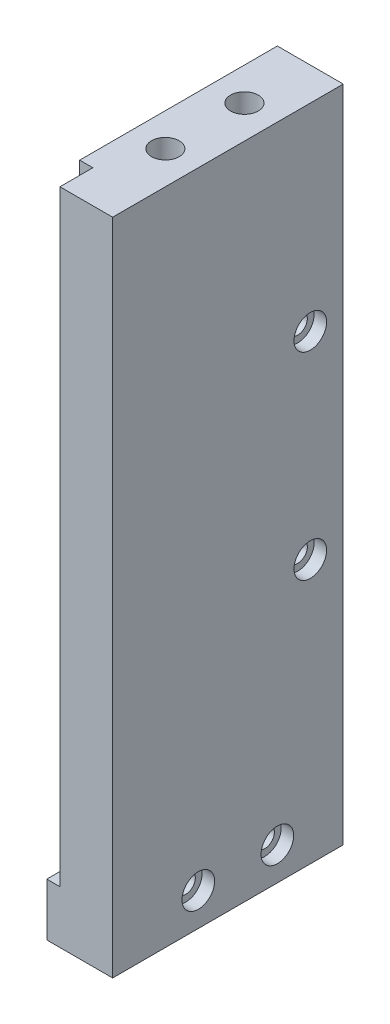
ISO-10303-21;
HEADER;
FILE_DESCRIPTION(('STEP AP214'),'2;1');
FILE_NAME('part.step','',(''),(''),'','','');
FILE_SCHEMA(('AUTOMOTIVE_DESIGN { 1 0 10303 214 1 1 1 1 }'));
ENDSEC;
DATA;
#1=APPLICATION_CONTEXT('core data for automotive mechanical design processes');
#2=APPLICATION_PROTOCOL_DEFINITION('international standard','automotive_design',2000,#1);
#3=PRODUCT_CONTEXT('',#1,'mechanical');
#4=PRODUCT('Part','Part','',(#3));
#5=PRODUCT_RELATED_PRODUCT_CATEGORY('part','',(#4));
#6=PRODUCT_DEFINITION_FORMATION('','',#4);
#7=PRODUCT_DEFINITION_CONTEXT('part definition',#1,'design');
#8=PRODUCT_DEFINITION('design','',#6,#7);
#9=PRODUCT_DEFINITION_SHAPE('','',#8);
#10=(LENGTH_UNIT() NAMED_UNIT(*) SI_UNIT(.MILLI.,.METRE.));
#11=(NAMED_UNIT(*) PLANE_ANGLE_UNIT() SI_UNIT($,.RADIAN.));
#12=(NAMED_UNIT(*) SI_UNIT($,.STERADIAN.) SOLID_ANGLE_UNIT());
#13=UNCERTAINTY_MEASURE_WITH_UNIT(LENGTH_MEASURE(1.E-05),#10,'distance_accuracy_value','');
#14=(GEOMETRIC_REPRESENTATION_CONTEXT(3) GLOBAL_UNCERTAINTY_ASSIGNED_CONTEXT((#13)) GLOBAL_UNIT_ASSIGNED_CONTEXT((#10,
#11,#12)) REPRESENTATION_CONTEXT('',''));
#15=CARTESIAN_POINT('',(0.,0.,0.));
#16=DIRECTION('',(0.,0.,1.));
#17=DIRECTION('',(1.,0.,0.));
#18=AXIS2_PLACEMENT_3D('',#15,#16,#17);
#19=CARTESIAN_POINT('',(31.0654967691147,25.9679125528914,-114.348756211209));
#20=DIRECTION('',(0.,1.,0.));
#21=DIRECTION('',(0.,0.,1.));
#22=AXIS2_PLACEMENT_3D('',#19,#20,#21);
#23=PLANE('',#22);
#24=CARTESIAN_POINT('',(36.0654967691147,25.9679125528914,-3.84999999999986));
#25=DIRECTION('',(0.,1.,0.));
#26=DIRECTION('',(0.,0.,1.));
#27=AXIS2_PLACEMENT_3D('',#24,#25,#26);
#28=CIRCLE('',#27,2.1);
#29=CARTESIAN_POINT('',(36.0654967691147,25.9679125528914,-1.74999999999987));
#30=VERTEX_POINT('',#29);
#31=EDGE_CURVE('E148',#30,#30,#28,.T.);
#32=ORIENTED_EDGE('',*,*,#31,.F.);
#33=EDGE_LOOP('',(#32));
#34=FACE_BOUND('',#33,.T.);
#35=CARTESIAN_POINT('',(36.0654967691147,25.9679125528914,8.15000000000014));
#36=DIRECTION('',(0.,1.,0.));
#37=DIRECTION('',(0.,0.,1.));
#38=AXIS2_PLACEMENT_3D('',#35,#36,#37);
#39=CIRCLE('',#38,2.1);
#40=CARTESIAN_POINT('',(36.0654967691147,25.9679125528914,10.2500000000001));
#41=VERTEX_POINT('',#40);
#42=EDGE_CURVE('E158',#41,#41,#39,.T.);
#43=ORIENTED_EDGE('',*,*,#42,.F.);
#44=EDGE_LOOP('',(#43));
#45=FACE_BOUND('',#44,.T.);
#46=DIRECTION('',(-1.,0.,0.));
#47=VECTOR('',#46,1.);
#48=CARTESIAN_POINT('',(-23.9345032308853,25.9679125528914,16.1500000000001));
#49=LINE('',#48,#47);
#50=CARTESIAN_POINT('',(33.0654967691147,25.9679125528914,16.1500000000001));
#51=VERTEX_POINT('',#50);
#52=CARTESIAN_POINT('',(31.0654967691147,25.9679125528914,16.1500000000001));
#53=VERTEX_POINT('',#52);
#54=EDGE_CURVE('E178',#51,#53,#49,.T.);
#55=ORIENTED_EDGE('',*,*,#54,.F.);
#56=DIRECTION('',(0.,0.,-1.));
#57=VECTOR('',#56,1.);
#58=CARTESIAN_POINT('',(33.0654967691147,25.9679125528914,21.1500000000001));
#59=LINE('',#58,#57);
#60=CARTESIAN_POINT('',(33.0654967691147,25.9679125528914,21.1500000000001));
#61=VERTEX_POINT('',#60);
#62=EDGE_CURVE('E175',#61,#51,#59,.T.);
#63=ORIENTED_EDGE('',*,*,#62,.F.);
#64=DIRECTION('',(-1.,0.,0.));
#65=VECTOR('',#64,1.);
#66=CARTESIAN_POINT('',(31.0654967691147,25.9679125528914,21.1500000000001));
#67=LINE('',#66,#65);
#68=CARTESIAN_POINT('',(41.0654967691147,25.9679125528914,21.1500000000001));
#69=VERTEX_POINT('',#68);
#70=EDGE_CURVE('E108',#69,#61,#67,.T.);
#71=ORIENTED_EDGE('',*,*,#70,.F.);
#72=DIRECTION('',(0.,0.,1.));
#73=VECTOR('',#72,1.);
#74=CARTESIAN_POINT('',(41.0654967691147,25.9679125528914,-114.348756211209));
#75=LINE('',#74,#73);
#76=CARTESIAN_POINT('',(41.0654967691147,25.9679125528914,-13.8499999999999));
#77=VERTEX_POINT('',#76);
#78=EDGE_CURVE('E107',#77,#69,#75,.T.);
#79=ORIENTED_EDGE('',*,*,#78,.F.);
#80=DIRECTION('',(1.,0.,0.));
#81=VECTOR('',#80,1.);
#82=CARTESIAN_POINT('',(31.0654967691147,25.9679125528914,-13.8499999999999));
#83=LINE('',#82,#81);
#84=CARTESIAN_POINT('',(31.0654967691147,25.9679125528914,-13.8499999999999));
#85=VERTEX_POINT('',#84);
#86=EDGE_CURVE('E161',#85,#77,#83,.T.);
#87=ORIENTED_EDGE('',*,*,#86,.F.);
#88=DIRECTION('',(0.,0.,-1.));
#89=VECTOR('',#88,1.);
#90=CARTESIAN_POINT('',(31.0654967691147,25.9679125528914,16.1500000000001));
#91=LINE('',#90,#89);
#92=EDGE_CURVE('E131',#53,#85,#91,.T.);
#93=ORIENTED_EDGE('',*,*,#92,.F.);
#94=EDGE_LOOP('',(#55,#63,#71,#79,#87,#93));
#95=FACE_BOUND('',#94,.T.);
#96=ADVANCED_FACE('F34',(#34,#45,#95),#23,.T.);
#97=CARTESIAN_POINT('',(39.1654967691147,-67.5820874471086,-3.84999999999986));
#98=DIRECTION('',(-1.,0.,0.));
#99=DIRECTION('',(0.,0.,1.));
#100=AXIS2_PLACEMENT_3D('',#97,#98,#99);
#101=PLANE('',#100);
#102=CARTESIAN_POINT('',(39.1654967691147,-69.0320874471086,-3.84999999999986));
#103=DIRECTION('',(1.,0.,0.));
#104=DIRECTION('',(0.,0.,-1.));
#105=AXIS2_PLACEMENT_3D('',#102,#103,#104);
#106=CIRCLE('',#105,1.44999999999999);
#107=CARTESIAN_POINT('',(39.1654967691147,-69.0320874471086,-5.29999999999986));
#108=VERTEX_POINT('',#107);
#109=EDGE_CURVE('E214',#108,#108,#106,.T.);
#110=ORIENTED_EDGE('',*,*,#109,.F.);
#111=EDGE_LOOP('',(#110));
#112=FACE_BOUND('',#111,.T.);
#113=CARTESIAN_POINT('',(39.1654967691147,-69.0320874471086,-3.84999999999986));
#114=DIRECTION('',(1.,0.,0.));
#115=DIRECTION('',(0.,0.,-1.));
#116=AXIS2_PLACEMENT_3D('',#113,#114,#115);
#117=CIRCLE('',#116,2.47499999999999);
#118=CARTESIAN_POINT('',(39.1654967691147,-69.0320874471086,-6.32499999999986));
#119=VERTEX_POINT('',#118);
#120=EDGE_CURVE('E211',#119,#119,#117,.T.);
#121=ORIENTED_EDGE('',*,*,#120,.T.);
#122=EDGE_LOOP('',(#121));
#123=FACE_BOUND('',#122,.T.);
#124=ADVANCED_FACE('F256',(#112,#123),#101,.F.);
#125=CARTESIAN_POINT('',(41.0654967691147,-69.0320874471086,-3.84999999999986));
#126=DIRECTION('',(1.,0.,0.));
#127=DIRECTION('',(0.,0.,-1.));
#128=AXIS2_PLACEMENT_3D('',#125,#126,#127);
#129=CYLINDRICAL_SURFACE('',#128,1.44999999999999);
#130=CARTESIAN_POINT('',(31.0654967691147,-69.0320874471086,-3.84999999999986));
#131=DIRECTION('',(-1.,0.,0.));
#132=DIRECTION('',(0.,0.,1.));
#133=AXIS2_PLACEMENT_3D('',#130,#131,#132);
#134=CIRCLE('',#133,1.44999999999999);
#135=CARTESIAN_POINT('',(31.0654967691147,-69.0320874471086,-2.39999999999987));
#136=VERTEX_POINT('',#135);
#137=EDGE_CURVE('E11',#136,#136,#134,.F.);
#138=ORIENTED_EDGE('',*,*,#137,.F.);
#139=EDGE_LOOP('',(#138));
#140=FACE_BOUND('',#139,.T.);
#141=ORIENTED_EDGE('',*,*,#109,.T.);
#142=EDGE_LOOP('',(#141));
#143=FACE_BOUND('',#142,.T.);
#144=ADVANCED_FACE('F262',(#140,#143),#129,.F.);
#145=CARTESIAN_POINT('',(41.0654967691147,-69.0320874471086,-3.84999999999986));
#146=DIRECTION('',(1.,0.,0.));
#147=DIRECTION('',(0.,0.,-1.));
#148=AXIS2_PLACEMENT_3D('',#145,#146,#147);
#149=CYLINDRICAL_SURFACE('',#148,2.47499999999999);
#150=ORIENTED_EDGE('',*,*,#120,.F.);
#151=EDGE_LOOP('',(#150));
#152=FACE_BOUND('',#151,.T.);
#153=CARTESIAN_POINT('',(41.0654967691147,-69.0320874471086,-3.84999999999986));
#154=DIRECTION('',(1.,0.,0.));
#155=DIRECTION('',(0.,0.,-1.));
#156=AXIS2_PLACEMENT_3D('',#153,#154,#155);
#157=CIRCLE('',#156,2.47499999999999);
#158=CARTESIAN_POINT('',(41.0654967691147,-69.0320874471086,-6.32499999999986));
#159=VERTEX_POINT('',#158);
#160=EDGE_CURVE('E208',#159,#159,#157,.T.);
#161=ORIENTED_EDGE('',*,*,#160,.T.);
#162=EDGE_LOOP('',(#161));
#163=FACE_BOUND('',#162,.T.);
#164=ADVANCED_FACE('F303',(#152,#163),#149,.F.);
#165=CARTESIAN_POINT('',(39.1654967691147,-67.5820874471086,8.15000000000014));
#166=DIRECTION('',(-1.,0.,0.));
#167=DIRECTION('',(0.,0.,1.));
#168=AXIS2_PLACEMENT_3D('',#165,#166,#167);
#169=PLANE('',#168);
#170=CARTESIAN_POINT('',(39.1654967691147,-69.0320874471086,8.15000000000014));
#171=DIRECTION('',(1.,0.,0.));
#172=DIRECTION('',(0.,0.,-1.));
#173=AXIS2_PLACEMENT_3D('',#170,#171,#172);
#174=CIRCLE('',#173,1.44999999999999);
#175=CARTESIAN_POINT('',(39.1654967691147,-69.0320874471086,6.70000000000014));
#176=VERTEX_POINT('',#175);
#177=EDGE_CURVE('E205',#176,#176,#174,.T.);
#178=ORIENTED_EDGE('',*,*,#177,.F.);
#179=EDGE_LOOP('',(#178));
#180=FACE_BOUND('',#179,.T.);
#181=CARTESIAN_POINT('',(39.1654967691147,-69.0320874471086,8.15000000000014));
#182=DIRECTION('',(1.,0.,0.));
#183=DIRECTION('',(0.,0.,-1.));
#184=AXIS2_PLACEMENT_3D('',#181,#182,#183);
#185=CIRCLE('',#184,2.475);
#186=CARTESIAN_POINT('',(39.1654967691147,-69.0320874471086,5.67500000000014));
#187=VERTEX_POINT('',#186);
#188=EDGE_CURVE('E202',#187,#187,#185,.T.);
#189=ORIENTED_EDGE('',*,*,#188,.T.);
#190=EDGE_LOOP('',(#189));
#191=FACE_BOUND('',#190,.T.);
#192=ADVANCED_FACE('F300',(#180,#191),#169,.F.);
#193=CARTESIAN_POINT('',(41.0654967691147,-69.0320874471086,8.15000000000014));
#194=DIRECTION('',(1.,0.,0.));
#195=DIRECTION('',(0.,0.,-1.));
#196=AXIS2_PLACEMENT_3D('',#193,#194,#195);
#197=CYLINDRICAL_SURFACE('',#196,1.44999999999999);
#198=CARTESIAN_POINT('',(31.0654967691147,-69.0320874471086,8.15000000000014));
#199=DIRECTION('',(-1.,0.,0.));
#200=DIRECTION('',(0.,0.,1.));
#201=AXIS2_PLACEMENT_3D('',#198,#199,#200);
#202=CIRCLE('',#201,1.44999999999999);
#203=CARTESIAN_POINT('',(31.0654967691147,-69.0320874471086,9.60000000000013));
#204=VERTEX_POINT('',#203);
#205=EDGE_CURVE('E43',#204,#204,#202,.F.);
#206=ORIENTED_EDGE('',*,*,#205,.F.);
#207=EDGE_LOOP('',(#206));
#208=FACE_BOUND('',#207,.T.);
#209=ORIENTED_EDGE('',*,*,#177,.T.);
#210=EDGE_LOOP('',(#209));
#211=FACE_BOUND('',#210,.T.);
#212=ADVANCED_FACE('F298',(#208,#211),#197,.F.);
#213=CARTESIAN_POINT('',(41.0654967691147,-69.0320874471086,8.15000000000014));
#214=DIRECTION('',(1.,0.,0.));
#215=DIRECTION('',(0.,0.,-1.));
#216=AXIS2_PLACEMENT_3D('',#213,#214,#215);
#217=CYLINDRICAL_SURFACE('',#216,2.475);
#218=ORIENTED_EDGE('',*,*,#188,.F.);
#219=EDGE_LOOP('',(#218));
#220=FACE_BOUND('',#219,.T.);
#221=CARTESIAN_POINT('',(41.0654967691147,-69.0320874471086,8.15000000000014));
#222=DIRECTION('',(1.,0.,0.));
#223=DIRECTION('',(0.,0.,-1.));
#224=AXIS2_PLACEMENT_3D('',#221,#222,#223);
#225=CIRCLE('',#224,2.475);
#226=CARTESIAN_POINT('',(41.0654967691147,-69.0320874471086,5.67500000000014));
#227=VERTEX_POINT('',#226);
#228=EDGE_CURVE('E199',#227,#227,#225,.T.);
#229=ORIENTED_EDGE('',*,*,#228,.T.);
#230=EDGE_LOOP('',(#229));
#231=FACE_BOUND('',#230,.T.);
#232=ADVANCED_FACE('F291',(#220,#231),#217,.F.);
#233=CARTESIAN_POINT('',(39.1654967691147,-32.5820874471086,-8.84999999999986));
#234=DIRECTION('',(-1.,0.,0.));
#235=DIRECTION('',(0.,0.,1.));
#236=AXIS2_PLACEMENT_3D('',#233,#234,#235);
#237=PLANE('',#236);
#238=CARTESIAN_POINT('',(39.1654967691147,-34.0320874471086,-8.84999999999986));
#239=DIRECTION('',(1.,0.,0.));
#240=DIRECTION('',(0.,0.,-1.));
#241=AXIS2_PLACEMENT_3D('',#238,#239,#240);
#242=CIRCLE('',#241,1.44999999999999);
#243=CARTESIAN_POINT('',(39.1654967691147,-34.0320874471086,-10.2999999999999));
#244=VERTEX_POINT('',#243);
#245=EDGE_CURVE('E196',#244,#244,#242,.T.);
#246=ORIENTED_EDGE('',*,*,#245,.F.);
#247=EDGE_LOOP('',(#246));
#248=FACE_BOUND('',#247,.T.);
#249=CARTESIAN_POINT('',(39.1654967691147,-34.0320874471086,-8.84999999999986));
#250=DIRECTION('',(1.,0.,0.));
#251=DIRECTION('',(0.,0.,-1.));
#252=AXIS2_PLACEMENT_3D('',#249,#250,#251);
#253=CIRCLE('',#252,2.47499999999999);
#254=CARTESIAN_POINT('',(39.1654967691147,-34.0320874471086,-11.3249999999999));
#255=VERTEX_POINT('',#254);
#256=EDGE_CURVE('E193',#255,#255,#253,.T.);
#257=ORIENTED_EDGE('',*,*,#256,.T.);
#258=EDGE_LOOP('',(#257));
#259=FACE_BOUND('',#258,.T.);
#260=ADVANCED_FACE('F288',(#248,#259),#237,.F.);
#261=CARTESIAN_POINT('',(41.0654967691147,-34.0320874471086,-8.84999999999986));
#262=DIRECTION('',(1.,0.,0.));
#263=DIRECTION('',(0.,0.,-1.));
#264=AXIS2_PLACEMENT_3D('',#261,#262,#263);
#265=CYLINDRICAL_SURFACE('',#264,1.44999999999999);
#266=CARTESIAN_POINT('',(31.0654967691147,-34.0320874471086,-8.84999999999986));
#267=DIRECTION('',(-1.,0.,0.));
#268=DIRECTION('',(0.,0.,1.));
#269=AXIS2_PLACEMENT_3D('',#266,#267,#268);
#270=CIRCLE('',#269,1.44999999999999);
#271=CARTESIAN_POINT('',(31.0654967691147,-34.0320874471086,-7.39999999999987));
#272=VERTEX_POINT('',#271);
#273=EDGE_CURVE('E140',#272,#272,#270,.F.);
#274=ORIENTED_EDGE('',*,*,#273,.F.);
#275=EDGE_LOOP('',(#274));
#276=FACE_BOUND('',#275,.T.);
#277=ORIENTED_EDGE('',*,*,#245,.T.);
#278=EDGE_LOOP('',(#277));
#279=FACE_BOUND('',#278,.T.);
#280=ADVANCED_FACE('F286',(#276,#279),#265,.F.);
#281=CARTESIAN_POINT('',(41.0654967691147,-34.0320874471086,-8.84999999999986));
#282=DIRECTION('',(1.,0.,0.));
#283=DIRECTION('',(0.,0.,-1.));
#284=AXIS2_PLACEMENT_3D('',#281,#282,#283);
#285=CYLINDRICAL_SURFACE('',#284,2.47499999999999);
#286=ORIENTED_EDGE('',*,*,#256,.F.);
#287=EDGE_LOOP('',(#286));
#288=FACE_BOUND('',#287,.T.);
#289=CARTESIAN_POINT('',(41.0654967691147,-34.0320874471086,-8.84999999999986));
#290=DIRECTION('',(1.,0.,0.));
#291=DIRECTION('',(0.,0.,-1.));
#292=AXIS2_PLACEMENT_3D('',#289,#290,#291);
#293=CIRCLE('',#292,2.47499999999999);
#294=CARTESIAN_POINT('',(41.0654967691147,-34.0320874471086,-11.3249999999999));
#295=VERTEX_POINT('',#294);
#296=EDGE_CURVE('E190',#295,#295,#293,.T.);
#297=ORIENTED_EDGE('',*,*,#296,.T.);
#298=EDGE_LOOP('',(#297));
#299=FACE_BOUND('',#298,.T.);
#300=ADVANCED_FACE('F279',(#288,#299),#285,.F.);
#301=CARTESIAN_POINT('',(39.1654967691147,-2.58208744710861,-8.84999999999986));
#302=DIRECTION('',(-1.,0.,0.));
#303=DIRECTION('',(0.,0.,1.));
#304=AXIS2_PLACEMENT_3D('',#301,#302,#303);
#305=PLANE('',#304);
#306=CARTESIAN_POINT('',(39.1654967691147,-4.0320874471086,-8.84999999999986));
#307=DIRECTION('',(1.,0.,0.));
#308=DIRECTION('',(0.,0.,-1.));
#309=AXIS2_PLACEMENT_3D('',#306,#307,#308);
#310=CIRCLE('',#309,1.44999999999999);
#311=CARTESIAN_POINT('',(39.1654967691147,-4.0320874471086,-10.2999999999999));
#312=VERTEX_POINT('',#311);
#313=EDGE_CURVE('E187',#312,#312,#310,.T.);
#314=ORIENTED_EDGE('',*,*,#313,.F.);
#315=EDGE_LOOP('',(#314));
#316=FACE_BOUND('',#315,.T.);
#317=CARTESIAN_POINT('',(39.1654967691147,-4.0320874471086,-8.84999999999986));
#318=DIRECTION('',(1.,0.,0.));
#319=DIRECTION('',(0.,0.,-1.));
#320=AXIS2_PLACEMENT_3D('',#317,#318,#319);
#321=CIRCLE('',#320,2.475);
#322=CARTESIAN_POINT('',(39.1654967691147,-4.0320874471086,-11.3249999999999));
#323=VERTEX_POINT('',#322);
#324=EDGE_CURVE('E184',#323,#323,#321,.T.);
#325=ORIENTED_EDGE('',*,*,#324,.T.);
#326=EDGE_LOOP('',(#325));
#327=FACE_BOUND('',#326,.T.);
#328=ADVANCED_FACE('F276',(#316,#327),#305,.F.);
#329=CARTESIAN_POINT('',(41.0654967691147,-4.0320874471086,-8.84999999999986));
#330=DIRECTION('',(1.,0.,0.));
#331=DIRECTION('',(0.,0.,-1.));
#332=AXIS2_PLACEMENT_3D('',#329,#330,#331);
#333=CYLINDRICAL_SURFACE('',#332,1.44999999999999);
#334=CARTESIAN_POINT('',(31.0654967691147,-4.0320874471086,-8.84999999999986));
#335=DIRECTION('',(-1.,0.,0.));
#336=DIRECTION('',(0.,0.,1.));
#337=AXIS2_PLACEMENT_3D('',#334,#335,#336);
#338=CIRCLE('',#337,1.44999999999999);
#339=CARTESIAN_POINT('',(31.0654967691147,-4.0320874471086,-7.39999999999987));
#340=VERTEX_POINT('',#339);
#341=EDGE_CURVE('E138',#340,#340,#338,.F.);
#342=ORIENTED_EDGE('',*,*,#341,.F.);
#343=EDGE_LOOP('',(#342));
#344=FACE_BOUND('',#343,.T.);
#345=ORIENTED_EDGE('',*,*,#313,.T.);
#346=EDGE_LOOP('',(#345));
#347=FACE_BOUND('',#346,.T.);
#348=ADVANCED_FACE('F274',(#344,#347),#333,.F.);
#349=CARTESIAN_POINT('',(41.0654967691147,-4.0320874471086,-8.84999999999986));
#350=DIRECTION('',(1.,0.,0.));
#351=DIRECTION('',(0.,0.,-1.));
#352=AXIS2_PLACEMENT_3D('',#349,#350,#351);
#353=CYLINDRICAL_SURFACE('',#352,2.475);
#354=ORIENTED_EDGE('',*,*,#324,.F.);
#355=EDGE_LOOP('',(#354));
#356=FACE_BOUND('',#355,.T.);
#357=CARTESIAN_POINT('',(41.0654967691147,-4.0320874471086,-8.84999999999986));
#358=DIRECTION('',(1.,0.,0.));
#359=DIRECTION('',(0.,0.,-1.));
#360=AXIS2_PLACEMENT_3D('',#357,#358,#359);
#361=CIRCLE('',#360,2.475);
#362=CARTESIAN_POINT('',(41.0654967691147,-4.0320874471086,-11.3249999999999));
#363=VERTEX_POINT('',#362);
#364=EDGE_CURVE('E181',#363,#363,#361,.T.);
#365=ORIENTED_EDGE('',*,*,#364,.T.);
#366=EDGE_LOOP('',(#365));
#367=FACE_BOUND('',#366,.T.);
#368=ADVANCED_FACE('F271',(#356,#367),#353,.F.);
#369=CARTESIAN_POINT('',(-80.2845032308853,-74.0320874471086,-13.8499999999999));
#370=DIRECTION('',(0.,-1.,0.));
#371=DIRECTION('',(0.,0.,-1.));
#372=AXIS2_PLACEMENT_3D('',#369,#370,#371);
#373=PLANE('',#372);
#374=DIRECTION('',(1.,0.,0.));
#375=VECTOR('',#374,1.);
#376=CARTESIAN_POINT('',(-80.2845032308853,-74.0320874471086,21.1500000000001));
#377=LINE('',#376,#375);
#378=CARTESIAN_POINT('',(31.0654967691147,-74.0320874471086,21.1500000000001));
#379=VERTEX_POINT('',#378);
#380=CARTESIAN_POINT('',(41.0654967691147,-74.0320874471086,21.1500000000001));
#381=VERTEX_POINT('',#380);
#382=EDGE_CURVE('E114',#379,#381,#377,.T.);
#383=ORIENTED_EDGE('',*,*,#382,.F.);
#384=DIRECTION('',(0.,0.,1.));
#385=VECTOR('',#384,1.);
#386=CARTESIAN_POINT('',(31.0654967691147,-74.0320874471086,-114.348756211209));
#387=LINE('',#386,#385);
#388=CARTESIAN_POINT('',(31.0654967691147,-74.0320874471086,-13.8499999999999));
#389=VERTEX_POINT('',#388);
#390=EDGE_CURVE('E99',#389,#379,#387,.T.);
#391=ORIENTED_EDGE('',*,*,#390,.F.);
#392=DIRECTION('',(1.,0.,0.));
#393=VECTOR('',#392,1.);
#394=CARTESIAN_POINT('',(-80.2845032308853,-74.0320874471086,-13.8499999999999));
#395=LINE('',#394,#393);
#396=CARTESIAN_POINT('',(41.0654967691147,-74.0320874471086,-13.8499999999999));
#397=VERTEX_POINT('',#396);
#398=EDGE_CURVE('E58',#389,#397,#395,.T.);
#399=ORIENTED_EDGE('',*,*,#398,.T.);
#400=DIRECTION('',(0.,0.,1.));
#401=VECTOR('',#400,1.);
#402=CARTESIAN_POINT('',(41.0654967691147,-74.0320874471086,-13.8499999999999));
#403=LINE('',#402,#401);
#404=EDGE_CURVE('E118',#397,#381,#403,.T.);
#405=ORIENTED_EDGE('',*,*,#404,.T.);
#406=EDGE_LOOP('',(#383,#391,#399,#405));
#407=FACE_BOUND('',#406,.T.);
#408=ADVANCED_FACE('F36',(#407),#373,.T.);
#409=CARTESIAN_POINT('',(41.0654967691147,35.9679125528914,-13.8499999999999));
#410=DIRECTION('',(1.,0.,0.));
#411=DIRECTION('',(0.,1.,0.));
#412=AXIS2_PLACEMENT_3D('',#409,#410,#411);
#413=PLANE('',#412);
#414=ORIENTED_EDGE('',*,*,#364,.F.);
#415=EDGE_LOOP('',(#414));
#416=FACE_BOUND('',#415,.T.);
#417=ORIENTED_EDGE('',*,*,#296,.F.);
#418=EDGE_LOOP('',(#417));
#419=FACE_BOUND('',#418,.T.);
#420=ORIENTED_EDGE('',*,*,#228,.F.);
#421=EDGE_LOOP('',(#420));
#422=FACE_BOUND('',#421,.T.);
#423=ORIENTED_EDGE('',*,*,#160,.F.);
#424=EDGE_LOOP('',(#423));
#425=FACE_BOUND('',#424,.T.);
#426=DIRECTION('',(0.,1.,0.));
#427=VECTOR('',#426,1.);
#428=CARTESIAN_POINT('',(41.0654967691147,35.9679125528914,-13.8499999999999));
#429=LINE('',#428,#427);
#430=EDGE_CURVE('E134',#397,#77,#429,.T.);
#431=ORIENTED_EDGE('',*,*,#430,.T.);
#432=ORIENTED_EDGE('',*,*,#78,.T.);
#433=DIRECTION('',(0.,1.,0.));
#434=VECTOR('',#433,1.);
#435=CARTESIAN_POINT('',(41.0654967691147,35.9679125528914,21.1500000000001));
#436=LINE('',#435,#434);
#437=EDGE_CURVE('E120',#381,#69,#436,.T.);
#438=ORIENTED_EDGE('',*,*,#437,.F.);
#439=ORIENTED_EDGE('',*,*,#404,.F.);
#440=EDGE_LOOP('',(#431,#432,#438,#439));
#441=FACE_BOUND('',#440,.T.);
#442=ADVANCED_FACE('F239',(#416,#419,#422,#425,#441),#413,.T.);
#443=CARTESIAN_POINT('',(-23.9345032308853,-19.0320874471086,-13.8499999999999));
#444=DIRECTION('',(0.,0.,1.));
#445=DIRECTION('',(1.,0.,0.));
#446=AXIS2_PLACEMENT_3D('',#443,#444,#445);
#447=PLANE('',#446);
#448=DIRECTION('',(0.,1.,0.));
#449=VECTOR('',#448,1.);
#450=CARTESIAN_POINT('',(31.0654967691147,25.9679125528914,-13.8499999999999));
#451=LINE('',#450,#449);
#452=EDGE_CURVE('E51',#389,#85,#451,.T.);
#453=ORIENTED_EDGE('',*,*,#452,.T.);
#454=ORIENTED_EDGE('',*,*,#86,.T.);
#455=ORIENTED_EDGE('',*,*,#430,.F.);
#456=ORIENTED_EDGE('',*,*,#398,.F.);
#457=EDGE_LOOP('',(#453,#454,#455,#456));
#458=FACE_BOUND('',#457,.T.);
#459=ADVANCED_FACE('F243',(#458),#447,.F.);
#460=CARTESIAN_POINT('',(33.0654967691147,27.9679125528914,21.1500000000001));
#461=DIRECTION('',(-1.,0.,0.));
#462=DIRECTION('',(0.,0.,1.));
#463=AXIS2_PLACEMENT_3D('',#460,#461,#462);
#464=PLANE('',#463);
#465=DIRECTION('',(0.,1.,0.));
#466=VECTOR('',#465,1.);
#467=CARTESIAN_POINT('',(33.0654967691147,27.9679125528914,21.1500000000001));
#468=LINE('',#467,#466);
#469=CARTESIAN_POINT('',(33.0654967691147,-66.0320874471086,21.1500000000001));
#470=VERTEX_POINT('',#469);
#471=EDGE_CURVE('E126',#470,#61,#468,.T.);
#472=ORIENTED_EDGE('',*,*,#471,.T.);
#473=ORIENTED_EDGE('',*,*,#62,.T.);
#474=DIRECTION('',(0.,1.,0.));
#475=VECTOR('',#474,1.);
#476=CARTESIAN_POINT('',(33.0654967691147,27.9679125528914,16.1500000000001));
#477=LINE('',#476,#475);
#478=CARTESIAN_POINT('',(33.0654967691147,-66.0320874471086,16.1500000000001));
#479=VERTEX_POINT('',#478);
#480=EDGE_CURVE('E225',#479,#51,#477,.T.);
#481=ORIENTED_EDGE('',*,*,#480,.F.);
#482=DIRECTION('',(0.,0.,-1.));
#483=VECTOR('',#482,1.);
#484=CARTESIAN_POINT('',(33.0654967691147,-66.0320874471086,21.1500000000001));
#485=LINE('',#484,#483);
#486=EDGE_CURVE('E121',#470,#479,#485,.T.);
#487=ORIENTED_EDGE('',*,*,#486,.F.);
#488=EDGE_LOOP('',(#472,#473,#481,#487));
#489=FACE_BOUND('',#488,.T.);
#490=ADVANCED_FACE('F236',(#489),#464,.T.);
#491=CARTESIAN_POINT('',(-72.2845032308853,-66.0320874471086,21.1500000000001));
#492=DIRECTION('',(0.,1.,0.));
#493=DIRECTION('',(0.,0.,1.));
#494=AXIS2_PLACEMENT_3D('',#491,#492,#493);
#495=PLANE('',#494);
#496=DIRECTION('',(1.,0.,0.));
#497=VECTOR('',#496,1.);
#498=CARTESIAN_POINT('',(-72.2845032308853,-66.0320874471086,16.1500000000001));
#499=LINE('',#498,#497);
#500=CARTESIAN_POINT('',(31.0654967691147,-66.0320874471086,16.1500000000001));
#501=VERTEX_POINT('',#500);
#502=EDGE_CURVE('E223',#501,#479,#499,.T.);
#503=ORIENTED_EDGE('',*,*,#502,.F.);
#504=DIRECTION('',(0.,0.,1.));
#505=VECTOR('',#504,1.);
#506=CARTESIAN_POINT('',(31.0654967691147,-66.0320874471086,21.1500000000001));
#507=LINE('',#506,#505);
#508=CARTESIAN_POINT('',(31.0654967691147,-66.0320874471086,21.1500000000001));
#509=VERTEX_POINT('',#508);
#510=EDGE_CURVE('E164',#501,#509,#507,.T.);
#511=ORIENTED_EDGE('',*,*,#510,.T.);
#512=DIRECTION('',(1.,0.,0.));
#513=VECTOR('',#512,1.);
#514=CARTESIAN_POINT('',(-72.2845032308853,-66.0320874471086,21.1500000000001));
#515=LINE('',#514,#513);
#516=EDGE_CURVE('E116',#509,#470,#515,.T.);
#517=ORIENTED_EDGE('',*,*,#516,.T.);
#518=ORIENTED_EDGE('',*,*,#486,.T.);
#519=EDGE_LOOP('',(#503,#511,#517,#518));
#520=FACE_BOUND('',#519,.T.);
#521=ADVANCED_FACE('F250',(#520),#495,.T.);
#522=CARTESIAN_POINT('',(-23.9345032308853,-19.0320874471086,21.1500000000001));
#523=DIRECTION('',(0.,0.,1.));
#524=DIRECTION('',(1.,0.,0.));
#525=AXIS2_PLACEMENT_3D('',#522,#523,#524);
#526=PLANE('',#525);
#527=ORIENTED_EDGE('',*,*,#516,.F.);
#528=DIRECTION('',(0.,-1.,0.));
#529=VECTOR('',#528,1.);
#530=CARTESIAN_POINT('',(31.0654967691147,25.9679125528914,21.1500000000001));
#531=LINE('',#530,#529);
#532=EDGE_CURVE('E104',#509,#379,#531,.T.);
#533=ORIENTED_EDGE('',*,*,#532,.T.);
#534=ORIENTED_EDGE('',*,*,#382,.T.);
#535=ORIENTED_EDGE('',*,*,#437,.T.);
#536=ORIENTED_EDGE('',*,*,#70,.T.);
#537=ORIENTED_EDGE('',*,*,#471,.F.);
#538=EDGE_LOOP('',(#527,#533,#534,#535,#536,#537));
#539=FACE_BOUND('',#538,.T.);
#540=ADVANCED_FACE('F112',(#539),#526,.T.);
#541=CARTESIAN_POINT('',(31.0654967691147,25.9679125528914,16.1500000000001));
#542=DIRECTION('',(1.,0.,0.));
#543=DIRECTION('',(0.,0.,-1.));
#544=AXIS2_PLACEMENT_3D('',#541,#542,#543);
#545=PLANE('',#544);
#546=ORIENTED_EDGE('',*,*,#92,.T.);
#547=ORIENTED_EDGE('',*,*,#452,.F.);
#548=ORIENTED_EDGE('',*,*,#390,.T.);
#549=ORIENTED_EDGE('',*,*,#532,.F.);
#550=ORIENTED_EDGE('',*,*,#510,.F.);
#551=DIRECTION('',(0.,-1.,0.));
#552=VECTOR('',#551,1.);
#553=CARTESIAN_POINT('',(31.0654967691147,25.9679125528914,16.1500000000001));
#554=LINE('',#553,#552);
#555=EDGE_CURVE('E123',#53,#501,#554,.T.);
#556=ORIENTED_EDGE('',*,*,#555,.F.);
#557=EDGE_LOOP('',(#546,#547,#548,#549,#550,#556));
#558=FACE_BOUND('',#557,.T.);
#559=ORIENTED_EDGE('',*,*,#205,.T.);
#560=EDGE_LOOP('',(#559));
#561=FACE_BOUND('',#560,.T.);
#562=ORIENTED_EDGE('',*,*,#341,.T.);
#563=EDGE_LOOP('',(#562));
#564=FACE_BOUND('',#563,.T.);
#565=ORIENTED_EDGE('',*,*,#273,.T.);
#566=EDGE_LOOP('',(#565));
#567=FACE_BOUND('',#566,.T.);
#568=ORIENTED_EDGE('',*,*,#137,.T.);
#569=EDGE_LOOP('',(#568));
#570=FACE_BOUND('',#569,.T.);
#571=ADVANCED_FACE('F101',(#558,#561,#564,#567,#570),#545,.F.);
#572=CARTESIAN_POINT('',(-23.9345032308853,-19.0320874471086,16.1500000000001));
#573=DIRECTION('',(0.,0.,1.));
#574=DIRECTION('',(1.,0.,0.));
#575=AXIS2_PLACEMENT_3D('',#572,#573,#574);
#576=PLANE('',#575);
#577=ORIENTED_EDGE('',*,*,#555,.T.);
#578=ORIENTED_EDGE('',*,*,#502,.T.);
#579=ORIENTED_EDGE('',*,*,#480,.T.);
#580=ORIENTED_EDGE('',*,*,#54,.T.);
#581=EDGE_LOOP('',(#577,#578,#579,#580));
#582=FACE_BOUND('',#581,.T.);
#583=ADVANCED_FACE('F231',(#582),#576,.T.);
#584=CARTESIAN_POINT('',(36.0654967691147,19.4679125528914,-3.84999999999986));
#585=DIRECTION('',(0.,1.,0.));
#586=DIRECTION('',(0.,0.,1.));
#587=AXIS2_PLACEMENT_3D('',#584,#585,#586);
#588=PLANE('',#587);
#589=CARTESIAN_POINT('',(36.0654967691147,19.4679125528914,-3.84999999999986));
#590=DIRECTION('',(0.,1.,0.));
#591=DIRECTION('',(0.,0.,1.));
#592=AXIS2_PLACEMENT_3D('',#589,#590,#591);
#593=CIRCLE('',#592,2.1);
#594=CARTESIAN_POINT('',(36.0654967691147,19.4679125528914,-1.74999999999987));
#595=VERTEX_POINT('',#594);
#596=EDGE_CURVE('E143',#595,#595,#593,.T.);
#597=ORIENTED_EDGE('',*,*,#596,.T.);
#598=EDGE_LOOP('',(#597));
#599=FACE_BOUND('',#598,.T.);
#600=CARTESIAN_POINT('',(36.0654967691147,19.4679125528914,-3.84999999999986));
#601=DIRECTION('',(0.,1.,0.));
#602=DIRECTION('',(0.,0.,1.));
#603=AXIS2_PLACEMENT_3D('',#600,#601,#602);
#604=CIRCLE('',#603,1.44999999999999);
#605=CARTESIAN_POINT('',(36.0654967691147,19.4679125528914,-2.39999999999987));
#606=VERTEX_POINT('',#605);
#607=EDGE_CURVE('E141',#606,#606,#604,.F.);
#608=ORIENTED_EDGE('',*,*,#607,.T.);
#609=EDGE_LOOP('',(#608));
#610=FACE_BOUND('',#609,.T.);
#611=ADVANCED_FACE('F338',(#599,#610),#588,.T.);
#612=CARTESIAN_POINT('',(36.0654967691147,19.4679125528914,-3.84999999999986));
#613=DIRECTION('',(0.,1.,0.));
#614=DIRECTION('',(0.,0.,1.));
#615=AXIS2_PLACEMENT_3D('',#612,#613,#614);
#616=CYLINDRICAL_SURFACE('',#615,2.1);
#617=CARTESIAN_POINT('',(36.0654967691147,19.4679125528914,-1.74999999999987));
#618=CARTESIAN_POINT('',(36.0654967691147,19.5356208862247,-1.74999999999987));
#619=CARTESIAN_POINT('',(36.0654967691147,19.6033292195581,-1.74999999999987));
#620=CARTESIAN_POINT('',(36.0654967691147,19.7387458862247,-1.74999999999987));
#621=CARTESIAN_POINT('',(36.0654967691147,19.8064542195581,-1.74999999999987));
#622=CARTESIAN_POINT('',(36.0654967691147,19.9418708862247,-1.74999999999987));
#623=CARTESIAN_POINT('',(36.0654967691147,20.0095792195581,-1.74999999999987));
#624=CARTESIAN_POINT('',(36.0654967691147,20.1449958862247,-1.74999999999987));
#625=CARTESIAN_POINT('',(36.0654967691147,20.2127042195581,-1.74999999999987));
#626=CARTESIAN_POINT('',(36.0654967691147,20.3481208862247,-1.74999999999987));
#627=CARTESIAN_POINT('',(36.0654967691147,20.4158292195581,-1.74999999999987));
#628=CARTESIAN_POINT('',(36.0654967691147,20.5512458862247,-1.74999999999987));
#629=CARTESIAN_POINT('',(36.0654967691147,20.6189542195581,-1.74999999999987));
#630=CARTESIAN_POINT('',(36.0654967691147,20.7543708862247,-1.74999999999987));
#631=CARTESIAN_POINT('',(36.0654967691147,20.8220792195581,-1.74999999999987));
#632=CARTESIAN_POINT('',(36.0654967691147,20.9574958862247,-1.74999999999987));
#633=CARTESIAN_POINT('',(36.0654967691147,21.0252042195581,-1.74999999999987));
#634=CARTESIAN_POINT('',(36.0654967691147,21.1606208862247,-1.74999999999987));
#635=CARTESIAN_POINT('',(36.0654967691147,21.2283292195581,-1.74999999999987));
#636=CARTESIAN_POINT('',(36.0654967691147,21.3637458862247,-1.74999999999987));
#637=CARTESIAN_POINT('',(36.0654967691147,21.4314542195581,-1.74999999999987));
#638=CARTESIAN_POINT('',(36.0654967691147,21.5668708862247,-1.74999999999987));
#639=CARTESIAN_POINT('',(36.0654967691147,21.6345792195581,-1.74999999999987));
#640=CARTESIAN_POINT('',(36.0654967691147,21.7699958862247,-1.74999999999987));
#641=CARTESIAN_POINT('',(36.0654967691147,21.8377042195581,-1.74999999999987));
#642=CARTESIAN_POINT('',(36.0654967691147,21.9731208862247,-1.74999999999987));
#643=CARTESIAN_POINT('',(36.0654967691147,22.0408292195581,-1.74999999999987));
#644=CARTESIAN_POINT('',(36.0654967691147,22.1762458862247,-1.74999999999987));
#645=CARTESIAN_POINT('',(36.0654967691147,22.2439542195581,-1.74999999999987));
#646=CARTESIAN_POINT('',(36.0654967691147,22.3793708862247,-1.74999999999987));
#647=CARTESIAN_POINT('',(36.0654967691147,22.4470792195581,-1.74999999999987));
#648=CARTESIAN_POINT('',(36.0654967691147,22.5824958862247,-1.74999999999987));
#649=CARTESIAN_POINT('',(36.0654967691147,22.6502042195581,-1.74999999999987));
#650=CARTESIAN_POINT('',(36.0654967691147,22.7856208862247,-1.74999999999987));
#651=CARTESIAN_POINT('',(36.0654967691147,22.8533292195581,-1.74999999999987));
#652=CARTESIAN_POINT('',(36.0654967691147,22.9887458862247,-1.74999999999987));
#653=CARTESIAN_POINT('',(36.0654967691147,23.0564542195581,-1.74999999999987));
#654=CARTESIAN_POINT('',(36.0654967691147,23.1918708862247,-1.74999999999987));
#655=CARTESIAN_POINT('',(36.0654967691147,23.2595792195581,-1.74999999999987));
#656=CARTESIAN_POINT('',(36.0654967691147,23.3949958862247,-1.74999999999987));
#657=CARTESIAN_POINT('',(36.0654967691147,23.4627042195581,-1.74999999999987));
#658=CARTESIAN_POINT('',(36.0654967691147,23.5981208862247,-1.74999999999987));
#659=CARTESIAN_POINT('',(36.0654967691147,23.6658292195581,-1.74999999999987));
#660=CARTESIAN_POINT('',(36.0654967691147,23.8012458862247,-1.74999999999987));
#661=CARTESIAN_POINT('',(36.0654967691147,23.8689542195581,-1.74999999999987));
#662=CARTESIAN_POINT('',(36.0654967691147,24.0043708862247,-1.74999999999987));
#663=CARTESIAN_POINT('',(36.0654967691147,24.0720792195581,-1.74999999999987));
#664=CARTESIAN_POINT('',(36.0654967691147,24.2074958862247,-1.74999999999987));
#665=CARTESIAN_POINT('',(36.0654967691147,24.2752042195581,-1.74999999999987));
#666=CARTESIAN_POINT('',(36.0654967691147,24.4106208862247,-1.74999999999987));
#667=CARTESIAN_POINT('',(36.0654967691147,24.4783292195581,-1.74999999999987));
#668=CARTESIAN_POINT('',(36.0654967691147,24.6137458862247,-1.74999999999987));
#669=CARTESIAN_POINT('',(36.0654967691147,24.6814542195581,-1.74999999999987));
#670=CARTESIAN_POINT('',(36.0654967691147,24.8168708862247,-1.74999999999987));
#671=CARTESIAN_POINT('',(36.0654967691147,24.8845792195581,-1.74999999999987));
#672=CARTESIAN_POINT('',(36.0654967691147,25.0199958862247,-1.74999999999987));
#673=CARTESIAN_POINT('',(36.0654967691147,25.0877042195581,-1.74999999999987));
#674=CARTESIAN_POINT('',(36.0654967691147,25.2231208862247,-1.74999999999987));
#675=CARTESIAN_POINT('',(36.0654967691147,25.2908292195581,-1.74999999999987));
#676=CARTESIAN_POINT('',(36.0654967691147,25.4262458862247,-1.74999999999987));
#677=CARTESIAN_POINT('',(36.0654967691147,25.4939542195581,-1.74999999999987));
#678=CARTESIAN_POINT('',(36.0654967691147,25.6293708862247,-1.74999999999987));
#679=CARTESIAN_POINT('',(36.0654967691147,25.6970792195581,-1.74999999999987));
#680=CARTESIAN_POINT('',(36.0654967691147,25.8324958862247,-1.74999999999987));
#681=CARTESIAN_POINT('',(36.0654967691147,25.9002042195581,-1.74999999999987));
#682=CARTESIAN_POINT('',(36.0654967691147,25.9679125528914,-1.74999999999987));
#683=B_SPLINE_CURVE_WITH_KNOTS('',3,(#617,#618,#619,#620,#621,#622,#623,#624,#625,#626,#627,
#628,#629,#630,#631,#632,#633,#634,#635,#636,#637,#638,#639,#640,#641,#642,#643,#644,#645,#646,
#647,#648,#649,#650,#651,#652,#653,#654,#655,#656,#657,#658,#659,#660,#661,#662,#663,#664,#665,
#666,#667,#668,#669,#670,#671,#672,#673,#674,#675,#676,#677,#678,#679,#680,#681,#682),
.UNSPECIFIED.,.F.,.F.,(4,2,2,2,2,2,2,2,2,2,2,2,2,2,2,2,2,2,2,2,2,2,2,2,2,2,2,2,2,2,2,2,4),(0.,
0.203124999999998,0.406249999999997,0.609374999999999,0.812499999999997,1.015625,1.21875,
1.421875,1.625,1.828125,2.03125,2.234375,2.4375,2.640625,2.84375,3.046875,3.25,3.453125,3.65625,
3.859375,4.0625,4.26562499999999,4.46875,4.671875,4.875,5.078125,5.28125,5.484375,5.6875,
5.890625,6.09374999999999,6.296875,6.5),.UNSPECIFIED.);
#684=EDGE_CURVE('BSEAM342',#595,#30,#683,.T.);
#685=ORIENTED_EDGE('',*,*,#596,.F.);
#686=ORIENTED_EDGE('',*,*,#31,.T.);
#687=ORIENTED_EDGE('',*,*,#684,.T.);
#688=ORIENTED_EDGE('',*,*,#684,.F.);
#689=EDGE_LOOP('',(#685,#687,#686,#688));
#690=FACE_BOUND('',#689,.T.);
#691=ADVANCED_FACE('F342',(#690),#616,.F.);
#692=CARTESIAN_POINT('',(36.0654967691147,19.4679125528914,8.15000000000014));
#693=DIRECTION('',(0.,1.,0.));
#694=DIRECTION('',(0.,0.,1.));
#695=AXIS2_PLACEMENT_3D('',#692,#693,#694);
#696=PLANE('',#695);
#697=CARTESIAN_POINT('',(36.0654967691147,19.4679125528914,8.15000000000014));
#698=DIRECTION('',(0.,1.,0.));
#699=DIRECTION('',(0.,0.,1.));
#700=AXIS2_PLACEMENT_3D('',#697,#698,#699);
#701=CIRCLE('',#700,2.1);
#702=CARTESIAN_POINT('',(36.0654967691147,19.4679125528914,10.2500000000001));
#703=VERTEX_POINT('',#702);
#704=EDGE_CURVE('E153',#703,#703,#701,.T.);
#705=ORIENTED_EDGE('',*,*,#704,.T.);
#706=EDGE_LOOP('',(#705));
#707=FACE_BOUND('',#706,.T.);
#708=CARTESIAN_POINT('',(36.0654967691147,19.4679125528914,8.15000000000014));
#709=DIRECTION('',(0.,1.,0.));
#710=DIRECTION('',(0.,0.,1.));
#711=AXIS2_PLACEMENT_3D('',#708,#709,#710);
#712=CIRCLE('',#711,1.44999999999999);
#713=CARTESIAN_POINT('',(36.0654967691147,19.4679125528914,9.60000000000013));
#714=VERTEX_POINT('',#713);
#715=EDGE_CURVE('E38',#714,#714,#712,.F.);
#716=ORIENTED_EDGE('',*,*,#715,.T.);
#717=EDGE_LOOP('',(#716));
#718=FACE_BOUND('',#717,.T.);
#719=ADVANCED_FACE('F347',(#707,#718),#696,.T.);
#720=CARTESIAN_POINT('',(36.0654967691147,19.4679125528914,8.15000000000014));
#721=DIRECTION('',(0.,1.,0.));
#722=DIRECTION('',(0.,0.,1.));
#723=AXIS2_PLACEMENT_3D('',#720,#721,#722);
#724=CYLINDRICAL_SURFACE('',#723,2.1);
#725=CARTESIAN_POINT('',(36.0654967691147,19.4679125528914,10.2500000000001));
#726=CARTESIAN_POINT('',(36.0654967691147,19.5356208862247,10.2500000000001));
#727=CARTESIAN_POINT('',(36.0654967691147,19.6033292195581,10.2500000000001));
#728=CARTESIAN_POINT('',(36.0654967691147,19.7387458862247,10.2500000000001));
#729=CARTESIAN_POINT('',(36.0654967691147,19.8064542195581,10.2500000000001));
#730=CARTESIAN_POINT('',(36.0654967691147,19.9418708862247,10.2500000000001));
#731=CARTESIAN_POINT('',(36.0654967691147,20.0095792195581,10.2500000000001));
#732=CARTESIAN_POINT('',(36.0654967691147,20.1449958862247,10.2500000000001));
#733=CARTESIAN_POINT('',(36.0654967691147,20.2127042195581,10.2500000000001));
#734=CARTESIAN_POINT('',(36.0654967691147,20.3481208862247,10.2500000000001));
#735=CARTESIAN_POINT('',(36.0654967691147,20.4158292195581,10.2500000000001));
#736=CARTESIAN_POINT('',(36.0654967691147,20.5512458862247,10.2500000000001));
#737=CARTESIAN_POINT('',(36.0654967691147,20.6189542195581,10.2500000000001));
#738=CARTESIAN_POINT('',(36.0654967691147,20.7543708862247,10.2500000000001));
#739=CARTESIAN_POINT('',(36.0654967691147,20.8220792195581,10.2500000000001));
#740=CARTESIAN_POINT('',(36.0654967691147,20.9574958862247,10.2500000000001));
#741=CARTESIAN_POINT('',(36.0654967691147,21.0252042195581,10.2500000000001));
#742=CARTESIAN_POINT('',(36.0654967691147,21.1606208862247,10.2500000000001));
#743=CARTESIAN_POINT('',(36.0654967691147,21.2283292195581,10.2500000000001));
#744=CARTESIAN_POINT('',(36.0654967691147,21.3637458862247,10.2500000000001));
#745=CARTESIAN_POINT('',(36.0654967691147,21.4314542195581,10.2500000000001));
#746=CARTESIAN_POINT('',(36.0654967691147,21.5668708862247,10.2500000000001));
#747=CARTESIAN_POINT('',(36.0654967691147,21.6345792195581,10.2500000000001));
#748=CARTESIAN_POINT('',(36.0654967691147,21.7699958862247,10.2500000000001));
#749=CARTESIAN_POINT('',(36.0654967691147,21.8377042195581,10.2500000000001));
#750=CARTESIAN_POINT('',(36.0654967691147,21.9731208862247,10.2500000000001));
#751=CARTESIAN_POINT('',(36.0654967691147,22.0408292195581,10.2500000000001));
#752=CARTESIAN_POINT('',(36.0654967691147,22.1762458862247,10.2500000000001));
#753=CARTESIAN_POINT('',(36.0654967691147,22.2439542195581,10.2500000000001));
#754=CARTESIAN_POINT('',(36.0654967691147,22.3793708862247,10.2500000000001));
#755=CARTESIAN_POINT('',(36.0654967691147,22.4470792195581,10.2500000000001));
#756=CARTESIAN_POINT('',(36.0654967691147,22.5824958862247,10.2500000000001));
#757=CARTESIAN_POINT('',(36.0654967691147,22.6502042195581,10.2500000000001));
#758=CARTESIAN_POINT('',(36.0654967691147,22.7856208862247,10.2500000000001));
#759=CARTESIAN_POINT('',(36.0654967691147,22.8533292195581,10.2500000000001));
#760=CARTESIAN_POINT('',(36.0654967691147,22.9887458862247,10.2500000000001));
#761=CARTESIAN_POINT('',(36.0654967691147,23.0564542195581,10.2500000000001));
#762=CARTESIAN_POINT('',(36.0654967691147,23.1918708862247,10.2500000000001));
#763=CARTESIAN_POINT('',(36.0654967691147,23.2595792195581,10.2500000000001));
#764=CARTESIAN_POINT('',(36.0654967691147,23.3949958862247,10.2500000000001));
#765=CARTESIAN_POINT('',(36.0654967691147,23.4627042195581,10.2500000000001));
#766=CARTESIAN_POINT('',(36.0654967691147,23.5981208862247,10.2500000000001));
#767=CARTESIAN_POINT('',(36.0654967691147,23.6658292195581,10.2500000000001));
#768=CARTESIAN_POINT('',(36.0654967691147,23.8012458862247,10.2500000000001));
#769=CARTESIAN_POINT('',(36.0654967691147,23.8689542195581,10.2500000000001));
#770=CARTESIAN_POINT('',(36.0654967691147,24.0043708862247,10.2500000000001));
#771=CARTESIAN_POINT('',(36.0654967691147,24.0720792195581,10.2500000000001));
#772=CARTESIAN_POINT('',(36.0654967691147,24.2074958862247,10.2500000000001));
#773=CARTESIAN_POINT('',(36.0654967691147,24.2752042195581,10.2500000000001));
#774=CARTESIAN_POINT('',(36.0654967691147,24.4106208862247,10.2500000000001));
#775=CARTESIAN_POINT('',(36.0654967691147,24.4783292195581,10.2500000000001));
#776=CARTESIAN_POINT('',(36.0654967691147,24.6137458862247,10.2500000000001));
#777=CARTESIAN_POINT('',(36.0654967691147,24.6814542195581,10.2500000000001));
#778=CARTESIAN_POINT('',(36.0654967691147,24.8168708862247,10.2500000000001));
#779=CARTESIAN_POINT('',(36.0654967691147,24.8845792195581,10.2500000000001));
#780=CARTESIAN_POINT('',(36.0654967691147,25.0199958862247,10.2500000000001));
#781=CARTESIAN_POINT('',(36.0654967691147,25.0877042195581,10.2500000000001));
#782=CARTESIAN_POINT('',(36.0654967691147,25.2231208862247,10.2500000000001));
#783=CARTESIAN_POINT('',(36.0654967691147,25.2908292195581,10.2500000000001));
#784=CARTESIAN_POINT('',(36.0654967691147,25.4262458862247,10.2500000000001));
#785=CARTESIAN_POINT('',(36.0654967691147,25.4939542195581,10.2500000000001));
#786=CARTESIAN_POINT('',(36.0654967691147,25.6293708862247,10.2500000000001));
#787=CARTESIAN_POINT('',(36.0654967691147,25.6970792195581,10.2500000000001));
#788=CARTESIAN_POINT('',(36.0654967691147,25.8324958862247,10.2500000000001));
#789=CARTESIAN_POINT('',(36.0654967691147,25.9002042195581,10.2500000000001));
#790=CARTESIAN_POINT('',(36.0654967691147,25.9679125528914,10.2500000000001));
#791=B_SPLINE_CURVE_WITH_KNOTS('',3,(#725,#726,#727,#728,#729,#730,#731,#732,#733,#734,#735,
#736,#737,#738,#739,#740,#741,#742,#743,#744,#745,#746,#747,#748,#749,#750,#751,#752,#753,#754,
#755,#756,#757,#758,#759,#760,#761,#762,#763,#764,#765,#766,#767,#768,#769,#770,#771,#772,#773,
#774,#775,#776,#777,#778,#779,#780,#781,#782,#783,#784,#785,#786,#787,#788,#789,#790),
.UNSPECIFIED.,.F.,.F.,(4,2,2,2,2,2,2,2,2,2,2,2,2,2,2,2,2,2,2,2,2,2,2,2,2,2,2,2,2,2,2,2,4),(0.,
0.203124999999998,0.406249999999997,0.609374999999999,0.812499999999997,1.015625,1.21875,
1.421875,1.625,1.828125,2.03125,2.234375,2.4375,2.640625,2.84375,3.046875,3.25,3.453125,3.65625,
3.859375,4.0625,4.26562499999999,4.46875,4.671875,4.875,5.078125,5.28125,5.484375,5.6875,
5.890625,6.09374999999999,6.296875,6.5),.UNSPECIFIED.);
#792=EDGE_CURVE('BSEAM269',#703,#41,#791,.T.);
#793=ORIENTED_EDGE('',*,*,#704,.F.);
#794=ORIENTED_EDGE('',*,*,#42,.T.);
#795=ORIENTED_EDGE('',*,*,#792,.T.);
#796=ORIENTED_EDGE('',*,*,#792,.F.);
#797=EDGE_LOOP('',(#793,#795,#794,#796));
#798=FACE_BOUND('',#797,.T.);
#799=ADVANCED_FACE('F269',(#798),#724,.F.);
#800=CARTESIAN_POINT('',(36.0654967691147,15.9679125528914,-3.84999999999986));
#801=DIRECTION('',(0.,1.,0.));
#802=DIRECTION('',(0.,0.,1.));
#803=AXIS2_PLACEMENT_3D('',#800,#801,#802);
#804=CONICAL_SURFACE('',#803,1.44999999999999,1.02974425867664);
#805=CARTESIAN_POINT('',(36.0654967691147,15.0966646553014,-3.84999999999986));
#806=VERTEX_POINT('',#805);
#807=VERTEX_LOOP('',#806);
#808=FACE_BOUND('',#807,.T.);
#809=CARTESIAN_POINT('',(36.0654967691147,15.9679125528914,-3.84999999999986));
#810=DIRECTION('',(0.,1.,0.));
#811=DIRECTION('',(0.,0.,1.));
#812=AXIS2_PLACEMENT_3D('',#809,#810,#811);
#813=CIRCLE('',#812,1.44999999999999);
#814=CARTESIAN_POINT('',(36.0654967691147,15.9679125528914,-2.39999999999987));
#815=VERTEX_POINT('',#814);
#816=EDGE_CURVE('E220',#815,#815,#813,.T.);
#817=ORIENTED_EDGE('',*,*,#816,.T.);
#818=EDGE_LOOP('',(#817));
#819=FACE_BOUND('',#818,.T.);
#820=ADVANCED_FACE('F325',(#808,#819),#804,.F.);
#821=CARTESIAN_POINT('',(36.0654967691147,35.9679125528914,-3.84999999999986));
#822=DIRECTION('',(0.,1.,0.));
#823=DIRECTION('',(0.,0.,1.));
#824=AXIS2_PLACEMENT_3D('',#821,#822,#823);
#825=CYLINDRICAL_SURFACE('',#824,1.44999999999999);
#826=ORIENTED_EDGE('',*,*,#816,.F.);
#827=EDGE_LOOP('',(#826));
#828=FACE_BOUND('',#827,.T.);
#829=ORIENTED_EDGE('',*,*,#607,.F.);
#830=EDGE_LOOP('',(#829));
#831=FACE_BOUND('',#830,.T.);
#832=ADVANCED_FACE('F321',(#828,#831),#825,.F.);
#833=CARTESIAN_POINT('',(36.0654967691147,15.9679125528914,8.15000000000014));
#834=DIRECTION('',(0.,1.,0.));
#835=DIRECTION('',(0.,0.,1.));
#836=AXIS2_PLACEMENT_3D('',#833,#834,#835);
#837=CONICAL_SURFACE('',#836,1.44999999999999,1.02974425867664);
#838=CARTESIAN_POINT('',(36.0654967691147,15.0966646553014,8.15000000000014));
#839=VERTEX_POINT('',#838);
#840=VERTEX_LOOP('',#839);
#841=FACE_BOUND('',#840,.T.);
#842=CARTESIAN_POINT('',(36.0654967691147,15.9679125528914,8.15000000000014));
#843=DIRECTION('',(0.,1.,0.));
#844=DIRECTION('',(0.,0.,1.));
#845=AXIS2_PLACEMENT_3D('',#842,#843,#844);
#846=CIRCLE('',#845,1.44999999999999);
#847=CARTESIAN_POINT('',(36.0654967691147,15.9679125528914,9.60000000000013));
#848=VERTEX_POINT('',#847);
#849=EDGE_CURVE('E217',#848,#848,#846,.T.);
#850=ORIENTED_EDGE('',*,*,#849,.T.);
#851=EDGE_LOOP('',(#850));
#852=FACE_BOUND('',#851,.T.);
#853=ADVANCED_FACE('F317',(#841,#852),#837,.F.);
#854=CARTESIAN_POINT('',(36.0654967691147,35.9679125528914,8.15000000000014));
#855=DIRECTION('',(0.,1.,0.));
#856=DIRECTION('',(0.,0.,1.));
#857=AXIS2_PLACEMENT_3D('',#854,#855,#856);
#858=CYLINDRICAL_SURFACE('',#857,1.44999999999999);
#859=ORIENTED_EDGE('',*,*,#849,.F.);
#860=EDGE_LOOP('',(#859));
#861=FACE_BOUND('',#860,.T.);
#862=ORIENTED_EDGE('',*,*,#715,.F.);
#863=EDGE_LOOP('',(#862));
#864=FACE_BOUND('',#863,.T.);
#865=ADVANCED_FACE('F314',(#861,#864),#858,.F.);
#866=CLOSED_SHELL('',(#96,#124,#144,#164,#192,#212,#232,#260,#280,#300,#328,#348,#368,#408,#442,
#459,#490,#521,#540,#571,#583,#611,#691,#719,#799,#820,#832,#853,#865));
#867=MANIFOLD_SOLID_BREP('B2',#866);
#868=ADVANCED_BREP_SHAPE_REPRESENTATION('',(#18,#867),#14);
#869=SHAPE_DEFINITION_REPRESENTATION(#9,#868);
ENDSEC;
END-ISO-10303-21;
